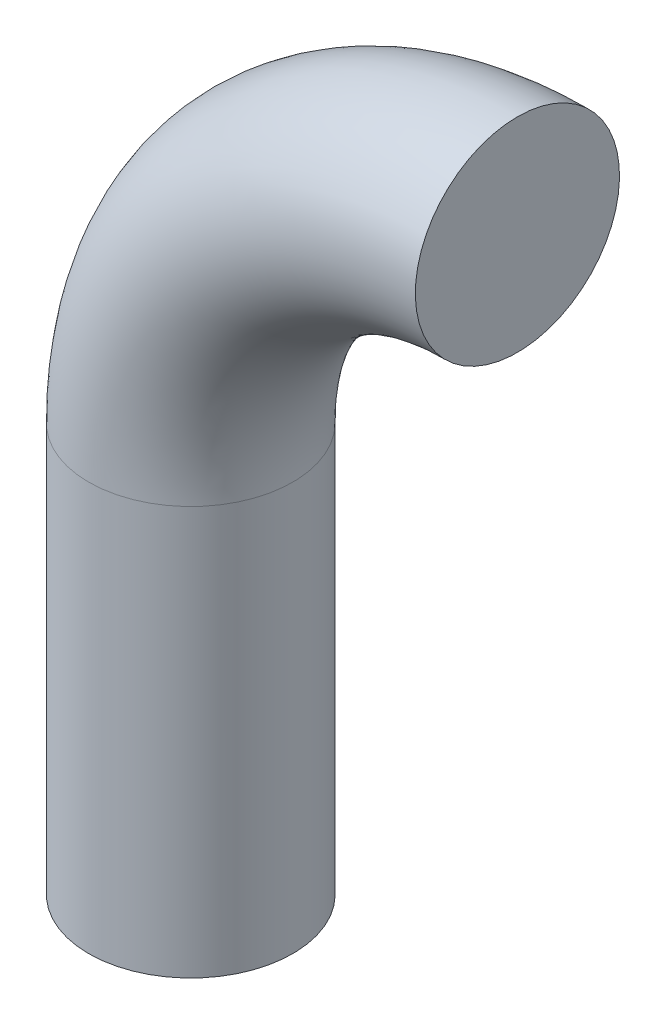
ISO-10303-21;
HEADER;
FILE_DESCRIPTION(('STEP AP214'),'2;1');
FILE_NAME('part.step','',(''),(''),'','','');
FILE_SCHEMA(('AUTOMOTIVE_DESIGN { 1 0 10303 214 1 1 1 1 }'));
ENDSEC;
DATA;
#1=APPLICATION_CONTEXT('core data for automotive mechanical design processes');
#2=APPLICATION_PROTOCOL_DEFINITION('international standard','automotive_design',2000,#1);
#3=PRODUCT_CONTEXT('',#1,'mechanical');
#4=PRODUCT('Part','Part','',(#3));
#5=PRODUCT_RELATED_PRODUCT_CATEGORY('part','',(#4));
#6=PRODUCT_DEFINITION_FORMATION('','',#4);
#7=PRODUCT_DEFINITION_CONTEXT('part definition',#1,'design');
#8=PRODUCT_DEFINITION('design','',#6,#7);
#9=PRODUCT_DEFINITION_SHAPE('','',#8);
#10=(LENGTH_UNIT() NAMED_UNIT(*) SI_UNIT(.MILLI.,.METRE.));
#11=(NAMED_UNIT(*) PLANE_ANGLE_UNIT() SI_UNIT($,.RADIAN.));
#12=(NAMED_UNIT(*) SI_UNIT($,.STERADIAN.) SOLID_ANGLE_UNIT());
#13=UNCERTAINTY_MEASURE_WITH_UNIT(LENGTH_MEASURE(1.E-05),#10,'distance_accuracy_value','');
#14=(GEOMETRIC_REPRESENTATION_CONTEXT(3) GLOBAL_UNCERTAINTY_ASSIGNED_CONTEXT((#13)) GLOBAL_UNIT_ASSIGNED_CONTEXT((#10,
#11,#12)) REPRESENTATION_CONTEXT('',''));
#15=CARTESIAN_POINT('',(0.,0.,0.));
#16=DIRECTION('',(0.,0.,1.));
#17=DIRECTION('',(1.,0.,0.));
#18=AXIS2_PLACEMENT_3D('',#15,#16,#17);
#19=CARTESIAN_POINT('',(0.,0.,0.));
#20=DIRECTION('',(0.,1.,0.));
#21=DIRECTION('',(0.,0.,1.));
#22=AXIS2_PLACEMENT_3D('',#19,#20,#21);
#23=PLANE('',#22);
#24=CARTESIAN_POINT('',(0.,0.,0.));
#25=DIRECTION('',(0.,1.,0.));
#26=DIRECTION('',(0.,0.,1.));
#27=AXIS2_PLACEMENT_3D('',#24,#25,#26);
#28=CIRCLE('',#27,22.);
#29=CARTESIAN_POINT('',(0.,0.,22.));
#30=VERTEX_POINT('',#29);
#31=EDGE_CURVE('E57',#30,#30,#28,.T.);
#32=ORIENTED_EDGE('',*,*,#31,.T.);
#33=EDGE_LOOP('',(#32));
#34=FACE_BOUND('',#33,.T.);
#35=CARTESIAN_POINT('',(0.,0.,0.));
#36=DIRECTION('',(0.,1.,0.));
#37=DIRECTION('',(0.,0.,1.));
#38=AXIS2_PLACEMENT_3D('',#35,#36,#37);
#39=CIRCLE('',#38,25.);
#40=CARTESIAN_POINT('',(0.,0.,25.));
#41=VERTEX_POINT('',#40);
#42=EDGE_CURVE('E49',#41,#41,#39,.T.);
#43=ORIENTED_EDGE('',*,*,#42,.F.);
#44=EDGE_LOOP('',(#43));
#45=FACE_BOUND('',#44,.T.);
#46=ADVANCED_FACE('F37',(#34,#45),#23,.F.);
#47=CARTESIAN_POINT('',(80.,180.,0.));
#48=DIRECTION('',(1.,0.,0.));
#49=DIRECTION('',(0.,0.,1.));
#50=AXIS2_PLACEMENT_3D('',#47,#48,#49);
#51=PLANE('',#50);
#52=CARTESIAN_POINT('',(80.,180.,0.));
#53=DIRECTION('',(1.,0.,0.));
#54=DIRECTION('',(0.,0.,1.));
#55=AXIS2_PLACEMENT_3D('',#52,#53,#54);
#56=CIRCLE('',#55,25.);
#57=CARTESIAN_POINT('',(80.,205.,0.));
#58=VERTEX_POINT('',#57);
#59=EDGE_CURVE('E10',#58,#58,#56,.T.);
#60=ORIENTED_EDGE('',*,*,#59,.T.);
#61=EDGE_LOOP('',(#60));
#62=FACE_BOUND('',#61,.T.);
#63=ADVANCED_FACE('F87',(#62),#51,.T.);
#64=CARTESIAN_POINT('',(0.,0.,0.));
#65=DIRECTION('',(0.,1.,0.));
#66=DIRECTION('',(0.,0.,1.));
#67=AXIS2_PLACEMENT_3D('',#64,#65,#66);
#68=CYLINDRICAL_SURFACE('',#67,25.);
#69=CARTESIAN_POINT('',(0.,100.,0.));
#70=DIRECTION('',(0.,1.,0.));
#71=DIRECTION('',(0.,0.,1.));
#72=AXIS2_PLACEMENT_3D('',#69,#70,#71);
#73=CIRCLE('',#72,25.);
#74=CARTESIAN_POINT('',(-25.,100.,0.));
#75=VERTEX_POINT('',#74);
#76=EDGE_CURVE('E44',#75,#75,#73,.T.);
#77=ORIENTED_EDGE('',*,*,#76,.F.);
#78=EDGE_LOOP('',(#77));
#79=FACE_BOUND('',#78,.T.);
#80=ORIENTED_EDGE('',*,*,#42,.T.);
#81=EDGE_LOOP('',(#80));
#82=FACE_BOUND('',#81,.T.);
#83=ADVANCED_FACE('F83',(#79,#82),#68,.T.);
#84=CARTESIAN_POINT('',(80.,100.,0.));
#85=DIRECTION('',(0.,0.,-1.));
#86=DIRECTION('',(-1.,0.,0.));
#87=AXIS2_PLACEMENT_3D('',#84,#85,#86);
#88=TOROIDAL_SURFACE('',#87,80.,25.);
#89=CARTESIAN_POINT('',(80.,100.,0.));
#90=DIRECTION('',(0.,0.,-1.));
#91=DIRECTION('',(-1.,0.,0.));
#92=AXIS2_PLACEMENT_3D('',#89,#90,#91);
#93=CIRCLE('',#92,105.);
#94=EDGE_CURVE('',#75,#58,#93,.T.);
#95=ORIENTED_EDGE('',*,*,#76,.T.);
#96=ORIENTED_EDGE('',*,*,#59,.F.);
#97=ORIENTED_EDGE('',*,*,#94,.T.);
#98=ORIENTED_EDGE('',*,*,#94,.F.);
#99=EDGE_LOOP('',(#95,#97,#96,#98));
#100=FACE_BOUND('',#99,.T.);
#101=ADVANCED_FACE('F86',(#100),#88,.T.);
#102=CARTESIAN_POINT('',(77.,180.,0.));
#103=DIRECTION('',(1.,0.,0.));
#104=DIRECTION('',(0.,0.,1.));
#105=AXIS2_PLACEMENT_3D('',#102,#103,#104);
#106=PLANE('',#105);
#107=CARTESIAN_POINT('',(77.,179.993255849846,-21.9999443330698));
#108=CARTESIAN_POINT('',(77.,180.611980929389,-21.9985578979744));
#109=CARTESIAN_POINT('',(77.,181.230574099488,-21.9710872256393));
#110=CARTESIAN_POINT('',(77.,182.463455332442,-21.8641718208152));
#111=CARTESIAN_POINT('',(77.,183.077742224252,-21.784713465795));
#112=CARTESIAN_POINT('',(77.,184.298109335695,-21.5742456108558));
#113=CARTESIAN_POINT('',(77.,184.904179742703,-21.4431792751416));
#114=CARTESIAN_POINT('',(77.,186.103078677421,-21.1304355937645));
#115=CARTESIAN_POINT('',(77.,186.695908079025,-20.9487615988802));
#116=CARTESIAN_POINT('',(77.,187.863889953808,-20.5361733695896));
#117=CARTESIAN_POINT('',(77.,188.439049908013,-20.3052803120398));
#118=CARTESIAN_POINT('',(77.,189.567874306119,-19.795839205557));
#119=CARTESIAN_POINT('',(77.,190.121538409958,-19.5172904030899));
#120=CARTESIAN_POINT('',(77.,191.203279709083,-18.9145927030779));
#121=CARTESIAN_POINT('',(77.,191.731363385622,-18.5904554382834));
#122=CARTESIAN_POINT('',(77.,192.758331634981,-17.8988285033573));
#123=CARTESIAN_POINT('',(77.,193.257216331506,-17.5313390169145));
#124=CARTESIAN_POINT('',(77.,194.222089862251,-16.7557322941942));
#125=CARTESIAN_POINT('',(77.,194.688088488946,-16.3476272399887));
#126=CARTESIAN_POINT('',(77.,195.584034622525,-15.4935956161298));
#127=CARTESIAN_POINT('',(77.,196.013982100489,-15.0476690161379));
#128=CARTESIAN_POINT('',(77.,196.834776517951,-14.1211464882234));
#129=CARTESIAN_POINT('',(77.,197.225622016496,-13.6405492837715));
#130=CARTESIAN_POINT('',(77.,197.965407749866,-12.6481176515201));
#131=CARTESIAN_POINT('',(77.,198.314348006928,-12.1362832402969));
#132=CARTESIAN_POINT('',(77.,198.967657643083,-11.0853034813734));
#133=CARTESIAN_POINT('',(77.,199.272051075176,-10.5461730853549));
#134=CARTESIAN_POINT('',(77.,199.834323302007,-9.44417903880189));
#135=CARTESIAN_POINT('',(77.,200.092202111654,-8.88131539587427));
#136=CARTESIAN_POINT('',(77.,200.559606172205,-7.73585986267636));
#137=CARTESIAN_POINT('',(77.,200.76913160543,-7.15326804680258));
#138=CARTESIAN_POINT('',(77.,201.138336441841,-5.97249844876739));
#139=CARTESIAN_POINT('',(77.,201.298015854068,-5.37432066943289));
#140=CARTESIAN_POINT('',(77.,201.566341099252,-4.16685603109179));
#141=CARTESIAN_POINT('',(77.,201.675005557081,-3.55757331087454));
#142=CARTESIAN_POINT('',(77.,201.840612933538,-2.33201888251655));
#143=CARTESIAN_POINT('',(77.,201.897555866004,-1.71574717624564));
#144=CARTESIAN_POINT('',(77.,201.959314347612,-0.480599101929958));
#145=CARTESIAN_POINT('',(77.,201.964130043296,0.138277258787662));
#146=CARTESIAN_POINT('',(77.,201.921600113833,1.37423508110956));
#147=CARTESIAN_POINT('',(77.,201.874254490719,1.99131654278382));
#148=CARTESIAN_POINT('',(77.,201.727750761497,3.21920033259922));
#149=CARTESIAN_POINT('',(77.,201.628600731132,3.83000362430996));
#150=CARTESIAN_POINT('',(77.,201.379199236663,5.0410866384879));
#151=CARTESIAN_POINT('',(77.,201.228947779949,5.64136636247691));
#152=CARTESIAN_POINT('',(77.,200.878413495779,6.82713610937266));
#153=CARTESIAN_POINT('',(77.,200.678130627528,7.4126261202194));
#154=CARTESIAN_POINT('',(77.,200.228959938842,8.56465526081322));
#155=CARTESIAN_POINT('',(77.,199.980072113359,9.13119438859183));
#156=CARTESIAN_POINT('',(77.,199.435444239786,10.2413363898595));
#157=CARTESIAN_POINT('',(77.,199.139700846243,10.7849376220873));
#158=CARTESIAN_POINT('',(77.,198.503480279988,11.8452994981211));
#159=CARTESIAN_POINT('',(77.,198.163003107617,12.3620601421314));
#160=CARTESIAN_POINT('',(77.,197.439738399492,13.3650717140208));
#161=CARTESIAN_POINT('',(77.,197.056950855011,13.8513226356074));
#162=CARTESIAN_POINT('',(77.,196.251789262745,14.7898636624306));
#163=CARTESIAN_POINT('',(77.,195.829415205705,15.2421537597273));
#164=CARTESIAN_POINT('',(77.,194.947956103006,16.1096916903785));
#165=CARTESIAN_POINT('',(77.,194.488860356165,16.5249286508358));
#166=CARTESIAN_POINT('',(77.,193.537331861637,17.3152661652273));
#167=CARTESIAN_POINT('',(77.,193.044899109385,17.690366713667));
#168=CARTESIAN_POINT('',(77.,192.030197956462,18.3977731039977));
#169=CARTESIAN_POINT('',(77.,191.50792950801,18.7300788773529));
#170=CARTESIAN_POINT('',(77.,190.437270385128,19.3495414374384));
#171=CARTESIAN_POINT('',(77.,189.88887970196,19.6366982090706));
#172=CARTESIAN_POINT('',(77.,188.769606814364,20.1639560263893));
#173=CARTESIAN_POINT('',(77.,188.198714048307,20.4040346517532));
#174=CARTESIAN_POINT('',(77.,187.038740458229,20.8352674483367));
#175=CARTESIAN_POINT('',(77.,186.449659629259,21.0264216062439));
#176=CARTESIAN_POINT('',(77.,185.257494579729,21.3584553304701));
#177=CARTESIAN_POINT('',(77.,184.654410328255,21.4993347857904));
#178=CARTESIAN_POINT('',(77.,183.438523161206,21.7298252617396));
#179=CARTESIAN_POINT('',(77.,182.825720242092,21.8194362636979));
#180=CARTESIAN_POINT('',(77.,181.594399158199,21.946796138937));
#181=CARTESIAN_POINT('',(77.,180.975877965525,21.9845157393972));
#182=CARTESIAN_POINT('',(77.,179.737856183515,22.0077361566407));
#183=CARTESIAN_POINT('',(77.,179.118355593814,21.993236954));
#184=CARTESIAN_POINT('',(77.,177.882773647761,21.9121274417774));
#185=CARTESIAN_POINT('',(77.,177.266692300562,21.8455169927478));
#186=CARTESIAN_POINT('',(77.,176.042325451021,21.6606613760692));
#187=CARTESIAN_POINT('',(77.,175.434039950668,21.5424161952395));
#188=CARTESIAN_POINT('',(77.,174.229303712833,21.2550657666437));
#189=CARTESIAN_POINT('',(77.,173.63285861003,21.0859368945641));
#190=CARTESIAN_POINT('',(77.,172.456333825148,20.6980407522993));
#191=CARTESIAN_POINT('',(77.,171.876254149172,20.4792734636065));
#192=CARTESIAN_POINT('',(77.,170.736583139498,19.9936531283385));
#193=CARTESIAN_POINT('',(77.,170.176991840811,19.7267999995981));
#194=CARTESIAN_POINT('',(77.,169.08227848427,19.1469013161796));
#195=CARTESIAN_POINT('',(77.,168.547156424908,18.8338557643492));
#196=CARTESIAN_POINT('',(77.,167.505149489112,18.1637663420807));
#197=CARTESIAN_POINT('',(77.,166.998266791682,17.8067190831963));
#198=CARTESIAN_POINT('',(77.,166.016393968249,17.0511775572116));
#199=CARTESIAN_POINT('',(77.,165.541403847821,16.6526832828671));
#200=CARTESIAN_POINT('',(77.,164.626704077377,15.8170750471658));
#201=CARTESIAN_POINT('',(77.,164.186994403503,15.379961111926));
#202=CARTESIAN_POINT('',(77.,163.345995413708,14.4702159412639));
#203=CARTESIAN_POINT('',(77.,162.94470607713,13.9975847249382));
#204=CARTESIAN_POINT('',(77.,162.183636301548,13.0204426113501));
#205=CARTESIAN_POINT('',(77.,161.823832174748,12.5159501639299));
#206=CARTESIAN_POINT('',(77.,161.148041587016,11.4784242276209));
#207=CARTESIAN_POINT('',(77.,160.832055114351,10.9453907463748));
#208=CARTESIAN_POINT('',(77.,160.246166880369,9.85457509402669));
#209=CARTESIAN_POINT('',(77.,159.976264836385,9.29679307475073));
#210=CARTESIAN_POINT('',(77.,159.484481527354,8.16044668275629));
#211=CARTESIAN_POINT('',(77.,159.262600221775,7.58188232757955));
#212=CARTESIAN_POINT('',(77.,158.868676738759,6.40875523646154));
#213=CARTESIAN_POINT('',(77.,158.696578622391,5.81421128380152));
#214=CARTESIAN_POINT('',(77.,158.403124104395,4.61272996815452));
#215=CARTESIAN_POINT('',(77.,158.2817676657,4.00579261422147));
#216=CARTESIAN_POINT('',(77.,158.090670129752,2.78384818106655));
#217=CARTESIAN_POINT('',(77.,158.020928833724,2.16884113293143));
#218=CARTESIAN_POINT('',(77.,157.933563137777,0.935136387614955));
#219=CARTESIAN_POINT('',(77.,157.915938710722,0.316438692355384));
#220=CARTESIAN_POINT('',(77.,157.932925294462,-0.919635087604456));
#221=CARTESIAN_POINT('',(77.,157.967485381116,-1.53701187275051));
#222=CARTESIAN_POINT('',(77.,158.088498811715,-2.76665802739331));
#223=CARTESIAN_POINT('',(77.,158.174952116802,-3.37892740071413));
#224=CARTESIAN_POINT('',(77.,158.399130759859,-4.59400690620556));
#225=CARTESIAN_POINT('',(77.,158.536856145579,-5.1968170295663));
#226=CARTESIAN_POINT('',(77.,158.862590117285,-6.38869498928233));
#227=CARTESIAN_POINT('',(77.,159.050598717343,-6.97776282179208));
#228=CARTESIAN_POINT('',(77.,159.475556002387,-8.13798834293259));
#229=CARTESIAN_POINT('',(77.,159.712505848498,-8.70914560626709));
#230=CARTESIAN_POINT('',(77.,160.233646370385,-9.82948497456652));
#231=CARTESIAN_POINT('',(77.,160.517837047939,-10.3786670787051));
#232=CARTESIAN_POINT('',(77.,161.131417137799,-11.4511468546588));
#233=CARTESIAN_POINT('',(77.,161.460804954533,-11.9744454393407));
#234=CARTESIAN_POINT('',(77.,162.162436793371,-12.9914759923804));
#235=CARTESIAN_POINT('',(77.,162.53468080801,-13.4852079658881));
#236=CARTESIAN_POINT('',(77.,163.319716039953,-14.4400312161832));
#237=CARTESIAN_POINT('',(77.,163.732542269267,-14.9010937070009));
#238=CARTESIAN_POINT('',(77.,164.595531510399,-15.7868443560207));
#239=CARTESIAN_POINT('',(77.,165.045694688219,-16.2115323524815));
#240=CARTESIAN_POINT('',(77.,165.980276228702,-17.0216343243209));
#241=CARTESIAN_POINT('',(77.,166.464703444389,-17.4070380863203));
#242=CARTESIAN_POINT('',(77.,167.464258648151,-18.1357150301537));
#243=CARTESIAN_POINT('',(77.,167.979386173645,-18.4789888465459));
#244=CARTESIAN_POINT('',(77.,169.037527044611,-19.1214924651017));
#245=CARTESIAN_POINT('',(77.,169.580583067323,-19.4206519864199));
#246=CARTESIAN_POINT('',(77.,170.690001459649,-19.9721759276591));
#247=CARTESIAN_POINT('',(77.,171.256365388763,-20.2245372101339));
#248=CARTESIAN_POINT('',(77.,172.407715015645,-20.680398833623));
#249=CARTESIAN_POINT('',(77.,172.992679499266,-20.8839527254803));
#250=CARTESIAN_POINT('',(77.,174.177467923212,-21.241063657662));
#251=CARTESIAN_POINT('',(77.,174.777287926263,-21.3946337961558));
#252=CARTESIAN_POINT('',(77.,176.1397216789,-21.6829107295416));
#253=CARTESIAN_POINT('',(77.,176.905424360196,-21.8032195236423));
#254=CARTESIAN_POINT('',(77.,178.445238766316,-21.9626034267998));
#255=CARTESIAN_POINT('',(77.,179.219350495359,-22.0016784951063));
#256=CARTESIAN_POINT('',(77.,179.993255849846,-21.9999443330698));
#257=B_SPLINE_CURVE_WITH_KNOTS('',3,(#107,#108,#109,#110,#111,#112,#113,#114,#115,#116,#117,
#118,#119,#120,#121,#122,#123,#124,#125,#126,#127,#128,#129,#130,#131,#132,#133,#134,#135,#136,
#137,#138,#139,#140,#141,#142,#143,#144,#145,#146,#147,#148,#149,#150,#151,#152,#153,#154,#155,
#156,#157,#158,#159,#160,#161,#162,#163,#164,#165,#166,#167,#168,#169,#170,#171,#172,#173,#174,
#175,#176,#177,#178,#179,#180,#181,#182,#183,#184,#185,#186,#187,#188,#189,#190,#191,#192,#193,
#194,#195,#196,#197,#198,#199,#200,#201,#202,#203,#204,#205,#206,#207,#208,#209,#210,#211,#212,
#213,#214,#215,#216,#217,#218,#219,#220,#221,#222,#223,#224,#225,#226,#227,#228,#229,#230,#231,
#232,#233,#234,#235,#236,#237,#238,#239,#240,#241,#242,#243,#244,#245,#246,#247,#248,#249,#250,
#251,#252,#253,#254,#255,#256),.UNSPECIFIED.,.T.,.F.,(4,2,2,2,2,2,2,2,2,2,2,2,2,2,2,2,2,2,2,2,2,
2,2,2,2,2,2,2,2,2,2,2,2,2,2,2,2,2,2,2,2,2,2,2,2,2,2,2,2,2,2,2,2,2,2,2,2,2,2,2,2,2,2,2,2,2,2,2,2,
2,2,2,2,2,4),(0.,1.85550451350049,3.71149542677313,5.56953608290631,7.4274537457276,
9.28457363375474,11.1417228893313,12.9983991153449,14.8550674746738,16.7111806210297,
18.5672952562793,20.4234782663215,22.2796602913763,24.1348363459896,25.9900118059883,
27.8451802707529,29.7003483990377,31.5548387027719,33.4093285103664,35.263813104578,
37.1182976264818,38.9724931406646,40.8266883867112,42.68088514468,44.5350820952486,
46.3894114938524,48.2437408783566,50.0980706453074,51.9524008457898,53.8072734049898,
55.6621462181136,57.517022001778,59.371898405726,61.2276560352057,63.0834141696337,
64.9391764012601,66.7949393087117,68.6517486548541,70.5085586916824,72.3653736972777,
74.2221891768626,76.0798680738115,77.9375476633858,79.7952304272377,81.652913076561,
83.5107388702336,85.3685649886169,87.2263898506277,89.0842137137377,90.9409714618628,
92.7977287127854,94.6544745745447,96.5112188691176,98.3658686540041,100.220517084036,
102.075158371529,103.929798693357,105.782630337907,107.63546059506,109.488292577742,
111.3411250789,113.194001543315,115.046878077408,116.899689217101,118.752500034061,
120.606923618173,122.461355447655,124.316268181597,126.17115297354,128.028961674876,
129.886894882379,131.742780164626,133.598178722569,135.919054674428,138.239931790538),.UNSPECIFIED.);
#258=CARTESIAN_POINT('',(77.,179.993255849846,-21.9999443330698));
#259=VERTEX_POINT('',#258);
#260=EDGE_CURVE('E54',#259,#259,#257,.T.);
#261=ORIENTED_EDGE('',*,*,#260,.F.);
#262=EDGE_LOOP('',(#261));
#263=FACE_BOUND('',#262,.T.);
#264=ADVANCED_FACE('F72',(#263),#106,.F.);
#265=CARTESIAN_POINT('',(0.,0.,0.));
#266=DIRECTION('',(0.,1.,0.));
#267=DIRECTION('',(0.,0.,1.));
#268=AXIS2_PLACEMENT_3D('',#265,#266,#267);
#269=CYLINDRICAL_SURFACE('',#268,22.);
#270=CARTESIAN_POINT('',(0.,100.,0.));
#271=DIRECTION('',(0.,-1.,0.));
#272=DIRECTION('',(0.,0.,-1.));
#273=AXIS2_PLACEMENT_3D('',#270,#271,#272);
#274=CIRCLE('',#273,22.);
#275=CARTESIAN_POINT('',(0.,100.,-22.));
#276=VERTEX_POINT('',#275);
#277=EDGE_CURVE('E61',#276,#276,#274,.F.);
#278=ORIENTED_EDGE('',*,*,#277,.T.);
#279=EDGE_LOOP('',(#278));
#280=FACE_BOUND('',#279,.T.);
#281=ORIENTED_EDGE('',*,*,#31,.F.);
#282=EDGE_LOOP('',(#281));
#283=FACE_BOUND('',#282,.T.);
#284=ADVANCED_FACE('F78',(#280,#283),#269,.F.);
#285=CARTESIAN_POINT('',(80.,100.,0.));
#286=DIRECTION('',(0.,0.,-1.));
#287=DIRECTION('',(-1.,0.,0.));
#288=AXIS2_PLACEMENT_3D('',#285,#286,#287);
#289=TOROIDAL_SURFACE('',#288,80.,22.);
#290=ORIENTED_EDGE('',*,*,#260,.T.);
#291=EDGE_LOOP('',(#290));
#292=FACE_BOUND('',#291,.T.);
#293=ORIENTED_EDGE('',*,*,#277,.F.);
#294=EDGE_LOOP('',(#293));
#295=FACE_BOUND('',#294,.T.);
#296=ADVANCED_FACE('F74',(#292,#295),#289,.F.);
#297=CLOSED_SHELL('',(#46,#63,#83,#101,#264,#284,#296));
#298=MANIFOLD_SOLID_BREP('B2',#297);
#299=ADVANCED_BREP_SHAPE_REPRESENTATION('',(#18,#298),#14);
#300=SHAPE_DEFINITION_REPRESENTATION(#9,#299);
ENDSEC;
END-ISO-10303-21;
